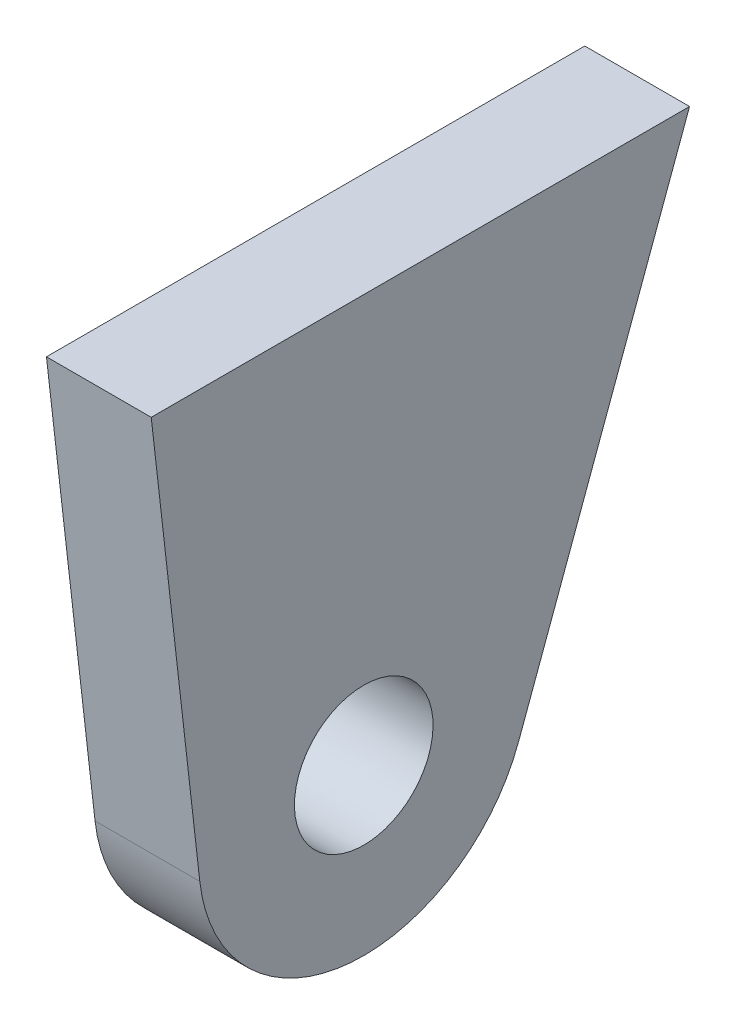
ISO-10303-21;
HEADER;
FILE_DESCRIPTION(('STEP AP214'),'2;1');
FILE_NAME('part.step','',(''),(''),'','','');
FILE_SCHEMA(('AUTOMOTIVE_DESIGN { 1 0 10303 214 1 1 1 1 }'));
ENDSEC;
DATA;
#1=APPLICATION_CONTEXT('core data for automotive mechanical design processes');
#2=APPLICATION_PROTOCOL_DEFINITION('international standard','automotive_design',2000,#1);
#3=PRODUCT_CONTEXT('',#1,'mechanical');
#4=PRODUCT('Part','Part','',(#3));
#5=PRODUCT_RELATED_PRODUCT_CATEGORY('part','',(#4));
#6=PRODUCT_DEFINITION_FORMATION('','',#4);
#7=PRODUCT_DEFINITION_CONTEXT('part definition',#1,'design');
#8=PRODUCT_DEFINITION('design','',#6,#7);
#9=PRODUCT_DEFINITION_SHAPE('','',#8);
#10=(LENGTH_UNIT() NAMED_UNIT(*) SI_UNIT(.MILLI.,.METRE.));
#11=(NAMED_UNIT(*) PLANE_ANGLE_UNIT() SI_UNIT($,.RADIAN.));
#12=(NAMED_UNIT(*) SI_UNIT($,.STERADIAN.) SOLID_ANGLE_UNIT());
#13=UNCERTAINTY_MEASURE_WITH_UNIT(LENGTH_MEASURE(1.E-05),#10,'distance_accuracy_value','');
#14=(GEOMETRIC_REPRESENTATION_CONTEXT(3) GLOBAL_UNCERTAINTY_ASSIGNED_CONTEXT((#13)) GLOBAL_UNIT_ASSIGNED_CONTEXT((#10,
#11,#12)) REPRESENTATION_CONTEXT('',''));
#15=CARTESIAN_POINT('',(0.,0.,0.));
#16=DIRECTION('',(0.,0.,1.));
#17=DIRECTION('',(1.,0.,0.));
#18=AXIS2_PLACEMENT_3D('',#15,#16,#17);
#19=CARTESIAN_POINT('',(-99.8649629149583,-357.223601629013,-907.3289681282));
#20=DIRECTION('',(-1.,-4.83307261899531E-13,0.));
#21=DIRECTION('',(4.83307261899531E-13,-1.,0.));
#22=AXIS2_PLACEMENT_3D('',#19,#20,#21);
#23=PLANE('',#22);
#24=DIRECTION('',(0.,0.,1.));
#25=VECTOR('',#24,1.);
#26=CARTESIAN_POINT('',(-99.8649629149703,-332.523601629013,-927.075106991279));
#27=LINE('',#26,#25);
#28=CARTESIAN_POINT('',(-99.8649629149703,-332.523601629013,-927.075106991279));
#29=VERTEX_POINT('',#28);
#30=CARTESIAN_POINT('',(-99.8649629149703,-332.523601629013,-894.448362552374));
#31=VERTEX_POINT('',#30);
#32=EDGE_CURVE('E88',#29,#31,#27,.T.);
#33=ORIENTED_EDGE('',*,*,#32,.T.);
#34=DIRECTION('',(4.80384962578192E-13,-0.993564504843119,-0.113267712592107));
#35=VECTOR('',#34,1.);
#36=CARTESIAN_POINT('',(-99.8649629149703,-332.523601629013,-894.448362552374));
#37=LINE('',#36,#35);
#38=CARTESIAN_POINT('',(-99.8649629149578,-358.356278754935,-897.393323079768));
#39=VERTEX_POINT('',#38);
#40=EDGE_CURVE('E83',#31,#39,#37,.T.);
#41=ORIENTED_EDGE('',*,*,#40,.T.);
#42=CARTESIAN_POINT('',(-99.8649629149583,-357.223601629013,-907.3289681282));
#43=DIRECTION('',(1.,4.83307261899531E-13,0.));
#44=DIRECTION('',(4.83307261899531E-13,-1.,0.));
#45=AXIS2_PLACEMENT_3D('',#42,#43,#44);
#46=CIRCLE('',#45,10.);
#47=CARTESIAN_POINT('',(-99.8649629149567,-360.677443287937,-916.713582014508));
#48=VERTEX_POINT('',#47);
#49=EDGE_CURVE('E86',#39,#48,#46,.T.);
#50=ORIENTED_EDGE('',*,*,#49,.T.);
#51=DIRECTION('',(-4.53341068388606E-13,0.938461388630791,-0.345384165892367));
#52=VECTOR('',#51,1.);
#53=CARTESIAN_POINT('',(-99.8649629149567,-360.677443287937,-916.713582014508));
#54=LINE('',#53,#52);
#55=EDGE_CURVE('E53',#48,#29,#54,.T.);
#56=ORIENTED_EDGE('',*,*,#55,.T.);
#57=EDGE_LOOP('',(#33,#41,#50,#56));
#58=FACE_BOUND('',#57,.T.);
#59=CARTESIAN_POINT('',(-99.8649629149583,-357.223601629013,-907.3289681282));
#60=DIRECTION('',(1.,4.83307261899531E-13,0.));
#61=DIRECTION('',(-4.83307261899531E-13,1.,0.));
#62=AXIS2_PLACEMENT_3D('',#59,#60,#61);
#63=CIRCLE('',#62,4.19999999999998);
#64=CARTESIAN_POINT('',(-99.8649629149604,-353.023601629013,-907.3289681282));
#65=VERTEX_POINT('',#64);
#66=EDGE_CURVE('E103',#65,#65,#63,.T.);
#67=ORIENTED_EDGE('',*,*,#66,.F.);
#68=EDGE_LOOP('',(#67));
#69=FACE_BOUND('',#68,.T.);
#70=ADVANCED_FACE('F36',(#58,#69),#23,.F.);
#71=CARTESIAN_POINT('',(-106.214962914958,-357.223601629017,-907.3289681282));
#72=DIRECTION('',(-1.,-4.83307261899531E-13,0.));
#73=DIRECTION('',(4.83307261899531E-13,-1.,0.));
#74=AXIS2_PLACEMENT_3D('',#71,#72,#73);
#75=PLANE('',#74);
#76=DIRECTION('',(0.,0.,1.));
#77=VECTOR('',#76,1.);
#78=CARTESIAN_POINT('',(-106.21496291497,-332.523601629017,-927.075106991279));
#79=LINE('',#78,#77);
#80=CARTESIAN_POINT('',(-106.21496291497,-332.523601629017,-927.075106991279));
#81=VERTEX_POINT('',#80);
#82=CARTESIAN_POINT('',(-106.21496291497,-332.523601629016,-894.448362552374));
#83=VERTEX_POINT('',#82);
#84=EDGE_CURVE('E100',#81,#83,#79,.T.);
#85=ORIENTED_EDGE('',*,*,#84,.F.);
#86=DIRECTION('',(-4.53341068388606E-13,0.938461388630791,-0.345384165892367));
#87=VECTOR('',#86,1.);
#88=CARTESIAN_POINT('',(-106.214962914957,-360.67744328794,-916.713582014508));
#89=LINE('',#88,#87);
#90=CARTESIAN_POINT('',(-106.214962914957,-360.67744328794,-916.713582014508));
#91=VERTEX_POINT('',#90);
#92=EDGE_CURVE('E76',#91,#81,#89,.T.);
#93=ORIENTED_EDGE('',*,*,#92,.F.);
#94=CARTESIAN_POINT('',(-106.214962914958,-357.223601629017,-907.3289681282));
#95=DIRECTION('',(1.,4.83307261899531E-13,0.));
#96=DIRECTION('',(4.83307261899531E-13,-1.,0.));
#97=AXIS2_PLACEMENT_3D('',#94,#95,#96);
#98=CIRCLE('',#97,10.);
#99=CARTESIAN_POINT('',(-106.214962914958,-358.356278754938,-897.393323079768));
#100=VERTEX_POINT('',#99);
#101=EDGE_CURVE('E70',#100,#91,#98,.T.);
#102=ORIENTED_EDGE('',*,*,#101,.F.);
#103=DIRECTION('',(4.80384962578192E-13,-0.993564504843119,-0.113267712592107));
#104=VECTOR('',#103,1.);
#105=CARTESIAN_POINT('',(-106.21496291497,-332.523601629016,-894.448362552374));
#106=LINE('',#105,#104);
#107=EDGE_CURVE('E92',#83,#100,#106,.T.);
#108=ORIENTED_EDGE('',*,*,#107,.F.);
#109=EDGE_LOOP('',(#85,#93,#102,#108));
#110=FACE_BOUND('',#109,.T.);
#111=CARTESIAN_POINT('',(-106.214962914958,-357.223601629017,-907.3289681282));
#112=DIRECTION('',(1.,4.83307261899531E-13,0.));
#113=DIRECTION('',(-4.83307261899531E-13,1.,0.));
#114=AXIS2_PLACEMENT_3D('',#111,#112,#113);
#115=CIRCLE('',#114,4.19999999999998);
#116=CARTESIAN_POINT('',(-106.21496291496,-353.023601629017,-907.3289681282));
#117=VERTEX_POINT('',#116);
#118=EDGE_CURVE('E115',#117,#117,#115,.T.);
#119=ORIENTED_EDGE('',*,*,#118,.T.);
#120=EDGE_LOOP('',(#119));
#121=FACE_BOUND('',#120,.T.);
#122=ADVANCED_FACE('F111',(#110,#121),#75,.T.);
#123=CARTESIAN_POINT('',(-99.8649629149703,-332.523601629013,-927.075106991279));
#124=DIRECTION('',(4.83307261899531E-13,-1.,0.));
#125=DIRECTION('',(1.,4.83307261899531E-13,0.));
#126=AXIS2_PLACEMENT_3D('',#123,#124,#125);
#127=PLANE('',#126);
#128=ORIENTED_EDGE('',*,*,#84,.T.);
#129=DIRECTION('',(-1.,-4.83307261899531E-13,0.));
#130=VECTOR('',#129,1.);
#131=CARTESIAN_POINT('',(-99.8649629149703,-332.523601629013,-894.448362552374));
#132=LINE('',#131,#130);
#133=EDGE_CURVE('E11',#31,#83,#132,.T.);
#134=ORIENTED_EDGE('',*,*,#133,.F.);
#135=ORIENTED_EDGE('',*,*,#32,.F.);
#136=DIRECTION('',(-1.,-4.83307261899531E-13,0.));
#137=VECTOR('',#136,1.);
#138=CARTESIAN_POINT('',(-99.8649629149703,-332.523601629013,-927.075106991279));
#139=LINE('',#138,#137);
#140=EDGE_CURVE('E96',#29,#81,#139,.T.);
#141=ORIENTED_EDGE('',*,*,#140,.T.);
#142=EDGE_LOOP('',(#128,#134,#135,#141));
#143=FACE_BOUND('',#142,.T.);
#144=ADVANCED_FACE('F38',(#143),#127,.F.);
#145=CARTESIAN_POINT('',(-99.8649629149703,-332.523601629013,-894.448362552374));
#146=DIRECTION('',(0.,0.113267712592107,-0.993564504843119));
#147=DIRECTION('',(0.,0.993564504843119,0.113267712592107));
#148=AXIS2_PLACEMENT_3D('',#145,#146,#147);
#149=PLANE('',#148);
#150=ORIENTED_EDGE('',*,*,#107,.T.);
#151=DIRECTION('',(-1.,-4.83307261899531E-13,0.));
#152=VECTOR('',#151,1.);
#153=CARTESIAN_POINT('',(-99.8649629149578,-358.356278754935,-897.393323079768));
#154=LINE('',#153,#152);
#155=EDGE_CURVE('E45',#39,#100,#154,.T.);
#156=ORIENTED_EDGE('',*,*,#155,.F.);
#157=ORIENTED_EDGE('',*,*,#40,.F.);
#158=ORIENTED_EDGE('',*,*,#133,.T.);
#159=EDGE_LOOP('',(#150,#156,#157,#158));
#160=FACE_BOUND('',#159,.T.);
#161=ADVANCED_FACE('F91',(#160),#149,.F.);
#162=CARTESIAN_POINT('',(-99.8649629149583,-357.223601629013,-907.3289681282));
#163=DIRECTION('',(-1.,-4.83307261899531E-13,0.));
#164=DIRECTION('',(4.83307261899531E-13,-1.,0.));
#165=AXIS2_PLACEMENT_3D('',#162,#163,#164);
#166=CYLINDRICAL_SURFACE('',#165,10.);
#167=ORIENTED_EDGE('',*,*,#101,.T.);
#168=DIRECTION('',(-1.,-4.83307261899531E-13,0.));
#169=VECTOR('',#168,1.);
#170=CARTESIAN_POINT('',(-99.8649629149567,-360.677443287937,-916.713582014508));
#171=LINE('',#170,#169);
#172=EDGE_CURVE('E93',#48,#91,#171,.T.);
#173=ORIENTED_EDGE('',*,*,#172,.F.);
#174=ORIENTED_EDGE('',*,*,#49,.F.);
#175=ORIENTED_EDGE('',*,*,#155,.T.);
#176=EDGE_LOOP('',(#167,#173,#174,#175));
#177=FACE_BOUND('',#176,.T.);
#178=ADVANCED_FACE('F94',(#177),#166,.T.);
#179=CARTESIAN_POINT('',(-99.8649629149567,-360.677443287937,-916.713582014508));
#180=DIRECTION('',(-1.6813477819336E-13,0.345384165892367,0.938461388630792));
#181=DIRECTION('',(0.,-0.938461388630792,0.345384165892367));
#182=AXIS2_PLACEMENT_3D('',#179,#180,#181);
#183=PLANE('',#182);
#184=ORIENTED_EDGE('',*,*,#92,.T.);
#185=ORIENTED_EDGE('',*,*,#140,.F.);
#186=ORIENTED_EDGE('',*,*,#55,.F.);
#187=ORIENTED_EDGE('',*,*,#172,.T.);
#188=EDGE_LOOP('',(#184,#185,#186,#187));
#189=FACE_BOUND('',#188,.T.);
#190=ADVANCED_FACE('F108',(#189),#183,.F.);
#191=CARTESIAN_POINT('',(-99.8649629149583,-357.223601629013,-907.3289681282));
#192=DIRECTION('',(-1.,-4.83307261899531E-13,0.));
#193=DIRECTION('',(4.83307261899531E-13,-1.,0.));
#194=AXIS2_PLACEMENT_3D('',#191,#192,#193);
#195=CYLINDRICAL_SURFACE('',#194,4.19999999999998);
#196=ORIENTED_EDGE('',*,*,#66,.T.);
#197=EDGE_LOOP('',(#196));
#198=FACE_BOUND('',#197,.T.);
#199=ORIENTED_EDGE('',*,*,#118,.F.);
#200=EDGE_LOOP('',(#199));
#201=FACE_BOUND('',#200,.T.);
#202=ADVANCED_FACE('F121',(#198,#201),#195,.F.);
#203=CLOSED_SHELL('',(#70,#122,#144,#161,#178,#190,#202));
#204=MANIFOLD_SOLID_BREP('B2',#203);
#205=ADVANCED_BREP_SHAPE_REPRESENTATION('',(#18,#204),#14);
#206=SHAPE_DEFINITION_REPRESENTATION(#9,#205);
ENDSEC;
END-ISO-10303-21;
